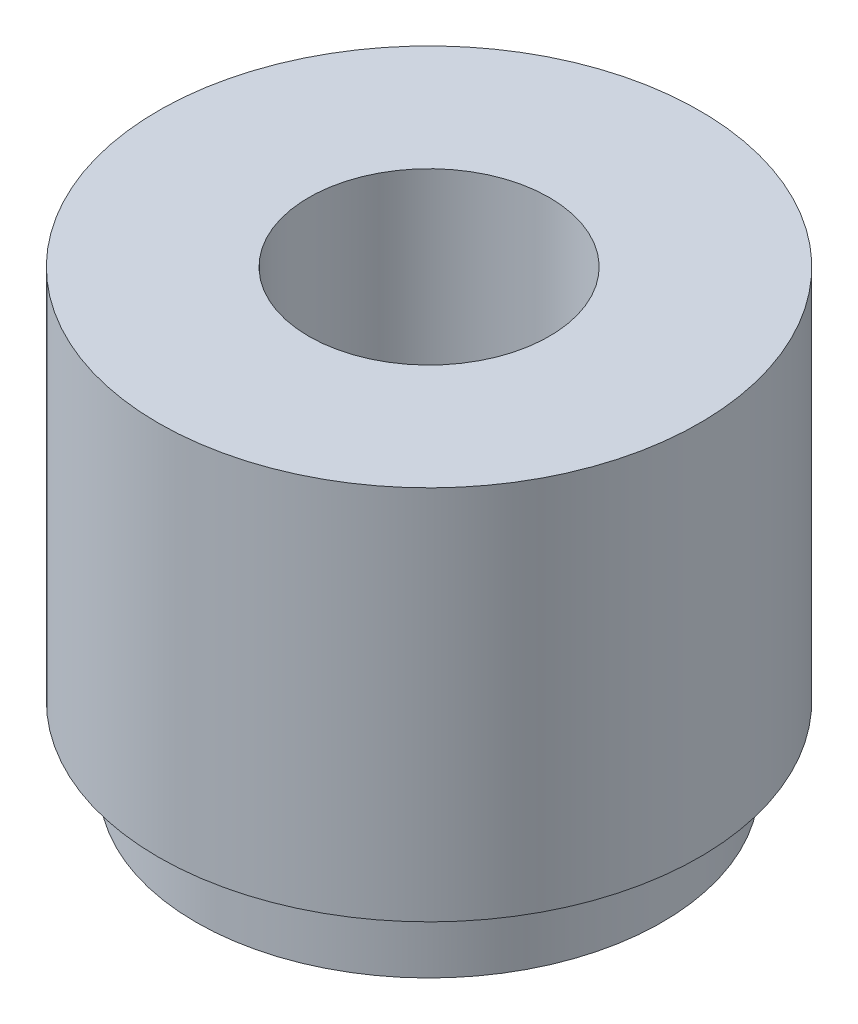
ISO-10303-21;
HEADER;
FILE_DESCRIPTION(('STEP AP214'),'2;1');
FILE_NAME('part.step','',(''),(''),'','','');
FILE_SCHEMA(('AUTOMOTIVE_DESIGN { 1 0 10303 214 1 1 1 1 }'));
ENDSEC;
DATA;
#1=APPLICATION_CONTEXT('core data for automotive mechanical design processes');
#2=APPLICATION_PROTOCOL_DEFINITION('international standard','automotive_design',2000,#1);
#3=PRODUCT_CONTEXT('',#1,'mechanical');
#4=PRODUCT('Part','Part','',(#3));
#5=PRODUCT_RELATED_PRODUCT_CATEGORY('part','',(#4));
#6=PRODUCT_DEFINITION_FORMATION('','',#4);
#7=PRODUCT_DEFINITION_CONTEXT('part definition',#1,'design');
#8=PRODUCT_DEFINITION('design','',#6,#7);
#9=PRODUCT_DEFINITION_SHAPE('','',#8);
#10=(LENGTH_UNIT() NAMED_UNIT(*) SI_UNIT(.MILLI.,.METRE.));
#11=(NAMED_UNIT(*) PLANE_ANGLE_UNIT() SI_UNIT($,.RADIAN.));
#12=(NAMED_UNIT(*) SI_UNIT($,.STERADIAN.) SOLID_ANGLE_UNIT());
#13=UNCERTAINTY_MEASURE_WITH_UNIT(LENGTH_MEASURE(1.E-05),#10,'distance_accuracy_value','');
#14=(GEOMETRIC_REPRESENTATION_CONTEXT(3) GLOBAL_UNCERTAINTY_ASSIGNED_CONTEXT((#13)) GLOBAL_UNIT_ASSIGNED_CONTEXT((#10,
#11,#12)) REPRESENTATION_CONTEXT('',''));
#15=CARTESIAN_POINT('',(0.,0.,0.));
#16=DIRECTION('',(0.,0.,1.));
#17=DIRECTION('',(1.,0.,0.));
#18=AXIS2_PLACEMENT_3D('',#15,#16,#17);
#19=CARTESIAN_POINT('',(0.,0.,0.));
#20=DIRECTION('',(0.,1.,0.));
#21=DIRECTION('',(0.,0.,1.));
#22=AXIS2_PLACEMENT_3D('',#19,#20,#21);
#23=PLANE('',#22);
#24=CARTESIAN_POINT('',(0.,0.,0.));
#25=DIRECTION('',(0.,1.,0.));
#26=DIRECTION('',(0.,0.,1.));
#27=AXIS2_PLACEMENT_3D('',#24,#25,#26);
#28=CIRCLE('',#27,0.799999999999998);
#29=CARTESIAN_POINT('',(0.,0.,0.799999999999998));
#30=VERTEX_POINT('',#29);
#31=EDGE_CURVE('E50',#30,#30,#28,.T.);
#32=ORIENTED_EDGE('',*,*,#31,.T.);
#33=EDGE_LOOP('',(#32));
#34=FACE_BOUND('',#33,.T.);
#35=CARTESIAN_POINT('',(0.,0.,0.));
#36=DIRECTION('',(0.,1.,0.));
#37=DIRECTION('',(0.,0.,1.));
#38=AXIS2_PLACEMENT_3D('',#35,#36,#37);
#39=CIRCLE('',#38,1.55);
#40=CARTESIAN_POINT('',(0.,0.,1.55));
#41=VERTEX_POINT('',#40);
#42=EDGE_CURVE('E10',#41,#41,#39,.T.);
#43=ORIENTED_EDGE('',*,*,#42,.F.);
#44=EDGE_LOOP('',(#43));
#45=FACE_BOUND('',#44,.T.);
#46=ADVANCED_FACE('F31',(#34,#45),#23,.F.);
#47=CARTESIAN_POINT('',(0.,3.,0.));
#48=DIRECTION('',(0.,1.,0.));
#49=DIRECTION('',(0.,0.,1.));
#50=AXIS2_PLACEMENT_3D('',#47,#48,#49);
#51=CYLINDRICAL_SURFACE('',#50,1.55);
#52=CARTESIAN_POINT('',(0.,0.5,0.));
#53=DIRECTION('',(0.,1.,0.));
#54=DIRECTION('',(0.,0.,1.));
#55=AXIS2_PLACEMENT_3D('',#52,#53,#54);
#56=CIRCLE('',#55,1.55);
#57=CARTESIAN_POINT('',(0.,0.5,1.55));
#58=VERTEX_POINT('',#57);
#59=EDGE_CURVE('E37',#58,#58,#56,.T.);
#60=ORIENTED_EDGE('',*,*,#59,.F.);
#61=EDGE_LOOP('',(#60));
#62=FACE_BOUND('',#61,.T.);
#63=ORIENTED_EDGE('',*,*,#42,.T.);
#64=EDGE_LOOP('',(#63));
#65=FACE_BOUND('',#64,.T.);
#66=ADVANCED_FACE('F73',(#62,#65),#51,.T.);
#67=CARTESIAN_POINT('',(1.55,0.5,0.));
#68=DIRECTION('',(0.,1.,0.));
#69=DIRECTION('',(0.,0.,1.));
#70=AXIS2_PLACEMENT_3D('',#67,#68,#69);
#71=PLANE('',#70);
#72=CARTESIAN_POINT('',(0.,0.5,0.));
#73=DIRECTION('',(0.,1.,0.));
#74=DIRECTION('',(0.,0.,1.));
#75=AXIS2_PLACEMENT_3D('',#72,#73,#74);
#76=CIRCLE('',#75,1.8);
#77=CARTESIAN_POINT('',(0.,0.5,1.8));
#78=VERTEX_POINT('',#77);
#79=EDGE_CURVE('E41',#78,#78,#76,.T.);
#80=ORIENTED_EDGE('',*,*,#79,.F.);
#81=EDGE_LOOP('',(#80));
#82=FACE_BOUND('',#81,.T.);
#83=ORIENTED_EDGE('',*,*,#59,.T.);
#84=EDGE_LOOP('',(#83));
#85=FACE_BOUND('',#84,.T.);
#86=ADVANCED_FACE('F68',(#82,#85),#71,.F.);
#87=CARTESIAN_POINT('',(0.,3.,0.));
#88=DIRECTION('',(0.,1.,0.));
#89=DIRECTION('',(0.,0.,1.));
#90=AXIS2_PLACEMENT_3D('',#87,#88,#89);
#91=CYLINDRICAL_SURFACE('',#90,1.8);
#92=CARTESIAN_POINT('',(0.,3.,0.));
#93=DIRECTION('',(0.,1.,0.));
#94=DIRECTION('',(0.,0.,1.));
#95=AXIS2_PLACEMENT_3D('',#92,#93,#94);
#96=CIRCLE('',#95,1.8);
#97=CARTESIAN_POINT('',(0.,3.,1.8));
#98=VERTEX_POINT('',#97);
#99=EDGE_CURVE('E45',#98,#98,#96,.T.);
#100=ORIENTED_EDGE('',*,*,#99,.F.);
#101=EDGE_LOOP('',(#100));
#102=FACE_BOUND('',#101,.T.);
#103=ORIENTED_EDGE('',*,*,#79,.T.);
#104=EDGE_LOOP('',(#103));
#105=FACE_BOUND('',#104,.T.);
#106=ADVANCED_FACE('F62',(#102,#105),#91,.T.);
#107=CARTESIAN_POINT('',(1.8,3.,0.));
#108=DIRECTION('',(0.,-1.,0.));
#109=DIRECTION('',(0.,0.,-1.));
#110=AXIS2_PLACEMENT_3D('',#107,#108,#109);
#111=PLANE('',#110);
#112=CARTESIAN_POINT('',(0.,3.,0.));
#113=DIRECTION('',(0.,1.,0.));
#114=DIRECTION('',(0.,0.,1.));
#115=AXIS2_PLACEMENT_3D('',#112,#113,#114);
#116=CIRCLE('',#115,0.799999999999999);
#117=CARTESIAN_POINT('',(0.,3.,0.799999999999999));
#118=VERTEX_POINT('',#117);
#119=EDGE_CURVE('E53',#118,#118,#116,.T.);
#120=ORIENTED_EDGE('',*,*,#119,.F.);
#121=EDGE_LOOP('',(#120));
#122=FACE_BOUND('',#121,.T.);
#123=ORIENTED_EDGE('',*,*,#99,.T.);
#124=EDGE_LOOP('',(#123));
#125=FACE_BOUND('',#124,.T.);
#126=ADVANCED_FACE('F59',(#122,#125),#111,.F.);
#127=CARTESIAN_POINT('',(0.,3.,0.));
#128=DIRECTION('',(0.,1.,0.));
#129=DIRECTION('',(0.,0.,1.));
#130=AXIS2_PLACEMENT_3D('',#127,#128,#129);
#131=CYLINDRICAL_SURFACE('',#130,0.799999999999999);
#132=ORIENTED_EDGE('',*,*,#31,.F.);
#133=EDGE_LOOP('',(#132));
#134=FACE_BOUND('',#133,.T.);
#135=ORIENTED_EDGE('',*,*,#119,.T.);
#136=EDGE_LOOP('',(#135));
#137=FACE_BOUND('',#136,.T.);
#138=ADVANCED_FACE('F57',(#134,#137),#131,.F.);
#139=CLOSED_SHELL('',(#46,#66,#86,#106,#126,#138));
#140=MANIFOLD_SOLID_BREP('B2',#139);
#141=ADVANCED_BREP_SHAPE_REPRESENTATION('',(#18,#140),#14);
#142=SHAPE_DEFINITION_REPRESENTATION(#9,#141);
ENDSEC;
END-ISO-10303-21;
